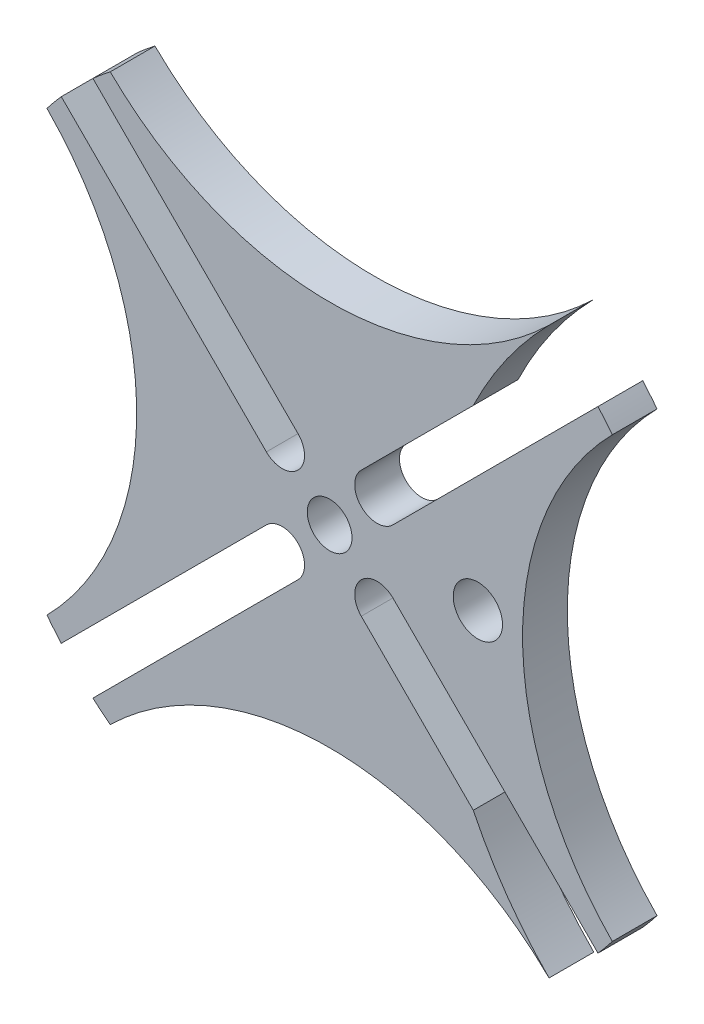
ISO-10303-21;
HEADER;
FILE_DESCRIPTION(('STEP AP214'),'2;1');
FILE_NAME('part.step','',(''),(''),'','','');
FILE_SCHEMA(('AUTOMOTIVE_DESIGN { 1 0 10303 214 1 1 1 1 }'));
ENDSEC;
DATA;
#1=APPLICATION_CONTEXT('core data for automotive mechanical design processes');
#2=APPLICATION_PROTOCOL_DEFINITION('international standard','automotive_design',2000,#1);
#3=PRODUCT_CONTEXT('',#1,'mechanical');
#4=PRODUCT('Part','Part','',(#3));
#5=PRODUCT_RELATED_PRODUCT_CATEGORY('part','',(#4));
#6=PRODUCT_DEFINITION_FORMATION('','',#4);
#7=PRODUCT_DEFINITION_CONTEXT('part definition',#1,'design');
#8=PRODUCT_DEFINITION('design','',#6,#7);
#9=PRODUCT_DEFINITION_SHAPE('','',#8);
#10=(LENGTH_UNIT() NAMED_UNIT(*) SI_UNIT(.MILLI.,.METRE.));
#11=(NAMED_UNIT(*) PLANE_ANGLE_UNIT() SI_UNIT($,.RADIAN.));
#12=(NAMED_UNIT(*) SI_UNIT($,.STERADIAN.) SOLID_ANGLE_UNIT());
#13=UNCERTAINTY_MEASURE_WITH_UNIT(LENGTH_MEASURE(1.E-05),#10,'distance_accuracy_value','');
#14=(GEOMETRIC_REPRESENTATION_CONTEXT(3) GLOBAL_UNCERTAINTY_ASSIGNED_CONTEXT((#13)) GLOBAL_UNIT_ASSIGNED_CONTEXT((#10,
#11,#12)) REPRESENTATION_CONTEXT('',''));
#15=CARTESIAN_POINT('',(0.,0.,0.));
#16=DIRECTION('',(0.,0.,1.));
#17=DIRECTION('',(1.,0.,0.));
#18=AXIS2_PLACEMENT_3D('',#15,#16,#17);
#19=CARTESIAN_POINT('',(4.49719912834645,0.,0.3975));
#20=DIRECTION('',(0.,0.,-1.));
#21=DIRECTION('',(-1.,0.,0.));
#22=AXIS2_PLACEMENT_3D('',#19,#20,#21);
#23=CYLINDRICAL_SURFACE('',#22,3.57750000000001);
#24=CARTESIAN_POINT('',(4.49719912834645,0.,0.));
#25=DIRECTION('',(0.,0.,1.));
#26=DIRECTION('',(1.,0.,0.));
#27=AXIS2_PLACEMENT_3D('',#24,#25,#26);
#28=CIRCLE('',#27,3.57750000000001);
#29=CARTESIAN_POINT('',(1.94995743455646,2.51198447515465,0.));
#30=VERTEX_POINT('',#29);
#31=CARTESIAN_POINT('',(1.27663119004415,1.55770613556581,0.));
#32=VERTEX_POINT('',#31);
#33=EDGE_CURVE('E251',#30,#32,#28,.T.);
#34=ORIENTED_EDGE('',*,*,#33,.F.);
#35=DIRECTION('',(0.,0.,-1.));
#36=VECTOR('',#35,1.);
#37=CARTESIAN_POINT('',(1.94995743455646,2.51198447515465,0.3975));
#38=LINE('',#37,#36);
#39=CARTESIAN_POINT('',(1.94995743455646,2.51198447515465,0.3975));
#40=VERTEX_POINT('',#39);
#41=EDGE_CURVE('E11',#40,#30,#38,.T.);
#42=ORIENTED_EDGE('',*,*,#41,.F.);
#43=CARTESIAN_POINT('',(4.49719912834645,0.,0.3975));
#44=DIRECTION('',(0.,0.,1.));
#45=DIRECTION('',(1.,0.,0.));
#46=AXIS2_PLACEMENT_3D('',#43,#44,#45);
#47=CIRCLE('',#46,3.57750000000001);
#48=CARTESIAN_POINT('',(1.27663119004415,1.55770613556581,0.3975));
#49=VERTEX_POINT('',#48);
#50=EDGE_CURVE('E396',#40,#49,#47,.T.);
#51=ORIENTED_EDGE('',*,*,#50,.T.);
#52=DIRECTION('',(0.,0.,-1.));
#53=VECTOR('',#52,1.);
#54=CARTESIAN_POINT('',(1.27663119004415,1.55770613556581,0.3975));
#55=LINE('',#54,#53);
#56=EDGE_CURVE('E146',#49,#32,#55,.T.);
#57=ORIENTED_EDGE('',*,*,#56,.T.);
#58=EDGE_LOOP('',(#34,#42,#51,#57));
#59=FACE_BOUND('',#58,.T.);
#60=ADVANCED_FACE('F41',(#59),#23,.F.);
#61=CARTESIAN_POINT('',(0.,0.,0.3975));
#62=DIRECTION('',(0.,0.,-1.));
#63=DIRECTION('',(-1.,0.,0.));
#64=AXIS2_PLACEMENT_3D('',#61,#62,#63);
#65=CYLINDRICAL_SURFACE('',#64,3.18);
#66=CARTESIAN_POINT('',(0.,0.,0.));
#67=DIRECTION('',(0.,0.,1.));
#68=DIRECTION('',(1.,0.,0.));
#69=AXIS2_PLACEMENT_3D('',#66,#67,#68);
#70=CIRCLE('',#69,3.18);
#71=CARTESIAN_POINT('',(1.9497991652137,2.51210732559975,0.));
#72=VERTEX_POINT('',#71);
#73=EDGE_CURVE('E254',#30,#72,#70,.T.);
#74=ORIENTED_EDGE('',*,*,#73,.T.);
#75=DIRECTION('',(0.,0.,-1.));
#76=VECTOR('',#75,1.);
#77=CARTESIAN_POINT('',(1.9497991652137,2.51210732559975,0.3975));
#78=LINE('',#77,#76);
#79=CARTESIAN_POINT('',(1.9497991652137,2.51210732559975,0.3975));
#80=VERTEX_POINT('',#79);
#81=EDGE_CURVE('E50',#80,#72,#78,.T.);
#82=ORIENTED_EDGE('',*,*,#81,.F.);
#83=CARTESIAN_POINT('',(0.,0.,0.3975));
#84=DIRECTION('',(0.,0.,1.));
#85=DIRECTION('',(1.,0.,0.));
#86=AXIS2_PLACEMENT_3D('',#83,#84,#85);
#87=CIRCLE('',#86,3.18);
#88=EDGE_CURVE('E394',#40,#80,#87,.T.);
#89=ORIENTED_EDGE('',*,*,#88,.F.);
#90=ORIENTED_EDGE('',*,*,#41,.T.);
#91=EDGE_LOOP('',(#74,#82,#89,#90));
#92=FACE_BOUND('',#91,.T.);
#93=ADVANCED_FACE('F379',(#92),#65,.T.);
#94=CARTESIAN_POINT('',(0.,4.49719912834645,0.3975));
#95=DIRECTION('',(0.,0.,-1.));
#96=DIRECTION('',(-1.,0.,0.));
#97=AXIS2_PLACEMENT_3D('',#94,#95,#96);
#98=CYLINDRICAL_SURFACE('',#97,2.7825);
#99=CARTESIAN_POINT('',(0.,4.49719912834645,0.));
#100=DIRECTION('',(0.,0.,1.));
#101=DIRECTION('',(1.,0.,0.));
#102=AXIS2_PLACEMENT_3D('',#99,#100,#101);
#103=CIRCLE('',#102,2.7825);
#104=CARTESIAN_POINT('',(-1.94979916521365,2.51210732559979,0.));
#105=VERTEX_POINT('',#104);
#106=EDGE_CURVE('E258',#105,#72,#103,.T.);
#107=ORIENTED_EDGE('',*,*,#106,.F.);
#108=DIRECTION('',(0.,0.,-1.));
#109=VECTOR('',#108,1.);
#110=CARTESIAN_POINT('',(-1.94979916521365,2.51210732559979,0.3975));
#111=LINE('',#110,#109);
#112=CARTESIAN_POINT('',(-1.94979916521365,2.51210732559979,0.3975));
#113=VERTEX_POINT('',#112);
#114=EDGE_CURVE('E369',#113,#105,#111,.T.);
#115=ORIENTED_EDGE('',*,*,#114,.F.);
#116=CARTESIAN_POINT('',(0.,4.49719912834645,0.3975));
#117=DIRECTION('',(0.,0.,1.));
#118=DIRECTION('',(1.,0.,0.));
#119=AXIS2_PLACEMENT_3D('',#116,#117,#118);
#120=CIRCLE('',#119,2.7825);
#121=EDGE_CURVE('E376',#113,#80,#120,.T.);
#122=ORIENTED_EDGE('',*,*,#121,.T.);
#123=ORIENTED_EDGE('',*,*,#81,.T.);
#124=EDGE_LOOP('',(#107,#115,#122,#123));
#125=FACE_BOUND('',#124,.T.);
#126=ADVANCED_FACE('F374',(#125),#98,.F.);
#127=CARTESIAN_POINT('',(0.,0.,0.3975));
#128=DIRECTION('',(0.,0.,-1.));
#129=DIRECTION('',(-1.,0.,0.));
#130=AXIS2_PLACEMENT_3D('',#127,#128,#129);
#131=CYLINDRICAL_SURFACE('',#130,3.18);
#132=CARTESIAN_POINT('',(0.,0.,0.));
#133=DIRECTION('',(0.,0.,1.));
#134=DIRECTION('',(1.,0.,0.));
#135=AXIS2_PLACEMENT_3D('',#132,#133,#134);
#136=CIRCLE('',#135,3.18);
#137=CARTESIAN_POINT('',(-2.1036659981281,2.38474094364979,0.));
#138=VERTEX_POINT('',#137);
#139=EDGE_CURVE('E261',#105,#138,#136,.T.);
#140=ORIENTED_EDGE('',*,*,#139,.T.);
#141=DIRECTION('',(0.,0.,-1.));
#142=VECTOR('',#141,1.);
#143=CARTESIAN_POINT('',(-2.1036659981281,2.38474094364979,0.3975));
#144=LINE('',#143,#142);
#145=CARTESIAN_POINT('',(-2.1036659981281,2.38474094364979,0.3975));
#146=VERTEX_POINT('',#145);
#147=EDGE_CURVE('E367',#146,#138,#144,.T.);
#148=ORIENTED_EDGE('',*,*,#147,.F.);
#149=CARTESIAN_POINT('',(0.,0.,0.3975));
#150=DIRECTION('',(0.,0.,1.));
#151=DIRECTION('',(1.,0.,0.));
#152=AXIS2_PLACEMENT_3D('',#149,#150,#151);
#153=CIRCLE('',#152,3.18);
#154=EDGE_CURVE('E390',#113,#146,#153,.T.);
#155=ORIENTED_EDGE('',*,*,#154,.F.);
#156=ORIENTED_EDGE('',*,*,#114,.T.);
#157=EDGE_LOOP('',(#140,#148,#155,#156));
#158=FACE_BOUND('',#157,.T.);
#159=ADVANCED_FACE('F387',(#158),#131,.T.);
#160=CARTESIAN_POINT('',(0.140537472760827,0.140537472760825,0.3975));
#161=DIRECTION('',(-0.707106781186554,-0.707106781186541,0.));
#162=DIRECTION('',(0.707106781186541,-0.707106781186554,0.));
#163=AXIS2_PLACEMENT_3D('',#160,#161,#162);
#164=PLANE('',#163);
#165=DIRECTION('',(-0.707106781186541,0.707106781186554,0.));
#166=VECTOR('',#165,1.);
#167=CARTESIAN_POINT('',(0.140537472760827,0.140537472760825,0.));
#168=LINE('',#167,#166);
#169=CARTESIAN_POINT('',(-0.281074945521648,0.562149891043308,0.));
#170=VERTEX_POINT('',#169);
#171=EDGE_CURVE('E264',#170,#138,#168,.T.);
#172=ORIENTED_EDGE('',*,*,#171,.F.);
#173=DIRECTION('',(0.,0.,-1.));
#174=VECTOR('',#173,1.);
#175=CARTESIAN_POINT('',(-0.281074945521648,0.562149891043308,0.3975));
#176=LINE('',#175,#174);
#177=CARTESIAN_POINT('',(-0.281074945521648,0.562149891043308,0.3975));
#178=VERTEX_POINT('',#177);
#179=EDGE_CURVE('E365',#178,#170,#176,.T.);
#180=ORIENTED_EDGE('',*,*,#179,.F.);
#181=DIRECTION('',(-0.707106781186541,0.707106781186554,0.));
#182=VECTOR('',#181,1.);
#183=CARTESIAN_POINT('',(0.140537472760827,0.140537472760825,0.3975));
#184=LINE('',#183,#182);
#185=EDGE_CURVE('E392',#178,#146,#184,.T.);
#186=ORIENTED_EDGE('',*,*,#185,.T.);
#187=ORIENTED_EDGE('',*,*,#147,.T.);
#188=EDGE_LOOP('',(#172,#180,#186,#187));
#189=FACE_BOUND('',#188,.T.);
#190=ADVANCED_FACE('F631',(#189),#164,.T.);
#191=CARTESIAN_POINT('',(-0.421612418282475,0.421612418282483,0.3975));
#192=DIRECTION('',(0.,0.,-1.));
#193=DIRECTION('',(-1.,0.,0.));
#194=AXIS2_PLACEMENT_3D('',#191,#192,#193);
#195=CYLINDRICAL_SURFACE('',#194,0.19875);
#196=CARTESIAN_POINT('',(-0.421612418282475,0.421612418282483,0.));
#197=DIRECTION('',(0.,0.,1.));
#198=DIRECTION('',(1.,0.,0.));
#199=AXIS2_PLACEMENT_3D('',#196,#197,#198);
#200=CIRCLE('',#199,0.19875);
#201=CARTESIAN_POINT('',(-0.562149891043303,0.281074945521658,0.));
#202=VERTEX_POINT('',#201);
#203=EDGE_CURVE('E267',#202,#170,#200,.T.);
#204=ORIENTED_EDGE('',*,*,#203,.F.);
#205=DIRECTION('',(0.,0.,-1.));
#206=VECTOR('',#205,1.);
#207=CARTESIAN_POINT('',(-0.562149891043303,0.281074945521658,0.3975));
#208=LINE('',#207,#206);
#209=CARTESIAN_POINT('',(-0.562149891043303,0.281074945521658,0.3975));
#210=VERTEX_POINT('',#209);
#211=EDGE_CURVE('E363',#210,#202,#208,.T.);
#212=ORIENTED_EDGE('',*,*,#211,.F.);
#213=CARTESIAN_POINT('',(-0.421612418282475,0.421612418282483,0.3975));
#214=DIRECTION('',(0.,0.,1.));
#215=DIRECTION('',(1.,0.,0.));
#216=AXIS2_PLACEMENT_3D('',#213,#214,#215);
#217=CIRCLE('',#216,0.19875);
#218=EDGE_CURVE('E401',#210,#178,#217,.T.);
#219=ORIENTED_EDGE('',*,*,#218,.T.);
#220=ORIENTED_EDGE('',*,*,#179,.T.);
#221=EDGE_LOOP('',(#204,#212,#219,#220));
#222=FACE_BOUND('',#221,.T.);
#223=ADVANCED_FACE('F620',(#222),#195,.F.);
#224=CARTESIAN_POINT('',(-0.14053747276082,-0.140537472760821,0.3975));
#225=DIRECTION('',(-0.707106781186544,-0.707106781186551,0.));
#226=DIRECTION('',(0.707106781186551,-0.707106781186544,0.));
#227=AXIS2_PLACEMENT_3D('',#224,#225,#226);
#228=PLANE('',#227);
#229=DIRECTION('',(-0.707106781186551,0.707106781186544,0.));
#230=VECTOR('',#229,1.);
#231=CARTESIAN_POINT('',(-0.14053747276082,-0.140537472760821,0.));
#232=LINE('',#231,#230);
#233=CARTESIAN_POINT('',(-2.38474094364978,2.10366599812812,0.));
#234=VERTEX_POINT('',#233);
#235=EDGE_CURVE('E270',#202,#234,#232,.T.);
#236=ORIENTED_EDGE('',*,*,#235,.T.);
#237=DIRECTION('',(0.,0.,-1.));
#238=VECTOR('',#237,1.);
#239=CARTESIAN_POINT('',(-2.38474094364978,2.10366599812812,0.3975));
#240=LINE('',#239,#238);
#241=CARTESIAN_POINT('',(-2.38474094364978,2.10366599812812,0.3975));
#242=VERTEX_POINT('',#241);
#243=EDGE_CURVE('E360',#242,#234,#240,.T.);
#244=ORIENTED_EDGE('',*,*,#243,.F.);
#245=DIRECTION('',(-0.707106781186551,0.707106781186544,0.));
#246=VECTOR('',#245,1.);
#247=CARTESIAN_POINT('',(-0.14053747276082,-0.140537472760821,0.3975));
#248=LINE('',#247,#246);
#249=EDGE_CURVE('E404',#210,#242,#248,.T.);
#250=ORIENTED_EDGE('',*,*,#249,.F.);
#251=ORIENTED_EDGE('',*,*,#211,.T.);
#252=EDGE_LOOP('',(#236,#244,#250,#251));
#253=FACE_BOUND('',#252,.T.);
#254=ADVANCED_FACE('F609',(#253),#228,.F.);
#255=CARTESIAN_POINT('',(0.,0.,0.3975));
#256=DIRECTION('',(0.,0.,-1.));
#257=DIRECTION('',(-1.,0.,0.));
#258=AXIS2_PLACEMENT_3D('',#255,#256,#257);
#259=CYLINDRICAL_SURFACE('',#258,3.18);
#260=CARTESIAN_POINT('',(0.,0.,0.));
#261=DIRECTION('',(0.,0.,1.));
#262=DIRECTION('',(1.,0.,0.));
#263=AXIS2_PLACEMENT_3D('',#260,#261,#262);
#264=CIRCLE('',#263,3.18);
#265=CARTESIAN_POINT('',(-2.51210732559975,1.9497991652137,0.));
#266=VERTEX_POINT('',#265);
#267=EDGE_CURVE('E273',#234,#266,#264,.T.);
#268=ORIENTED_EDGE('',*,*,#267,.T.);
#269=DIRECTION('',(0.,0.,-1.));
#270=VECTOR('',#269,1.);
#271=CARTESIAN_POINT('',(-2.51210732559975,1.9497991652137,0.3975));
#272=LINE('',#271,#270);
#273=CARTESIAN_POINT('',(-2.51210732559975,1.9497991652137,0.3975));
#274=VERTEX_POINT('',#273);
#275=EDGE_CURVE('E358',#274,#266,#272,.T.);
#276=ORIENTED_EDGE('',*,*,#275,.F.);
#277=CARTESIAN_POINT('',(0.,0.,0.3975));
#278=DIRECTION('',(0.,0.,1.));
#279=DIRECTION('',(1.,0.,0.));
#280=AXIS2_PLACEMENT_3D('',#277,#278,#279);
#281=CIRCLE('',#280,3.18);
#282=EDGE_CURVE('E407',#242,#274,#281,.T.);
#283=ORIENTED_EDGE('',*,*,#282,.F.);
#284=ORIENTED_EDGE('',*,*,#243,.T.);
#285=EDGE_LOOP('',(#268,#276,#283,#284));
#286=FACE_BOUND('',#285,.T.);
#287=ADVANCED_FACE('F598',(#286),#259,.T.);
#288=CARTESIAN_POINT('',(-4.49719912834645,0.,0.3975));
#289=DIRECTION('',(0.,0.,-1.));
#290=DIRECTION('',(-1.,0.,0.));
#291=AXIS2_PLACEMENT_3D('',#288,#289,#290);
#292=CYLINDRICAL_SURFACE('',#291,2.78250000000001);
#293=CARTESIAN_POINT('',(-4.49719912834645,0.,0.));
#294=DIRECTION('',(0.,0.,1.));
#295=DIRECTION('',(1.,0.,0.));
#296=AXIS2_PLACEMENT_3D('',#293,#294,#295);
#297=CIRCLE('',#296,2.78250000000001);
#298=CARTESIAN_POINT('',(-2.51210732559978,-1.94979916521367,0.));
#299=VERTEX_POINT('',#298);
#300=EDGE_CURVE('E276',#299,#266,#297,.T.);
#301=ORIENTED_EDGE('',*,*,#300,.F.);
#302=DIRECTION('',(0.,0.,-1.));
#303=VECTOR('',#302,1.);
#304=CARTESIAN_POINT('',(-2.51210732559978,-1.94979916521367,0.3975));
#305=LINE('',#304,#303);
#306=CARTESIAN_POINT('',(-2.51210732559978,-1.94979916521367,0.3975));
#307=VERTEX_POINT('',#306);
#308=EDGE_CURVE('E356',#307,#299,#305,.T.);
#309=ORIENTED_EDGE('',*,*,#308,.F.);
#310=CARTESIAN_POINT('',(-4.49719912834645,0.,0.3975));
#311=DIRECTION('',(0.,0.,1.));
#312=DIRECTION('',(1.,0.,0.));
#313=AXIS2_PLACEMENT_3D('',#310,#311,#312);
#314=CIRCLE('',#313,2.78250000000001);
#315=EDGE_CURVE('E409',#307,#274,#314,.T.);
#316=ORIENTED_EDGE('',*,*,#315,.T.);
#317=ORIENTED_EDGE('',*,*,#275,.T.);
#318=EDGE_LOOP('',(#301,#309,#316,#317));
#319=FACE_BOUND('',#318,.T.);
#320=ADVANCED_FACE('F587',(#319),#292,.F.);
#321=CARTESIAN_POINT('',(0.,0.,0.3975));
#322=DIRECTION('',(0.,0.,-1.));
#323=DIRECTION('',(-1.,0.,0.));
#324=AXIS2_PLACEMENT_3D('',#321,#322,#323);
#325=CYLINDRICAL_SURFACE('',#324,3.18);
#326=CARTESIAN_POINT('',(0.,0.,0.));
#327=DIRECTION('',(0.,0.,1.));
#328=DIRECTION('',(1.,0.,0.));
#329=AXIS2_PLACEMENT_3D('',#326,#327,#328);
#330=CIRCLE('',#329,3.18);
#331=CARTESIAN_POINT('',(-2.38474094364978,-2.10366599812811,0.));
#332=VERTEX_POINT('',#331);
#333=EDGE_CURVE('E279',#299,#332,#330,.T.);
#334=ORIENTED_EDGE('',*,*,#333,.T.);
#335=DIRECTION('',(0.,0.,-1.));
#336=VECTOR('',#335,1.);
#337=CARTESIAN_POINT('',(-2.38474094364978,-2.10366599812811,0.3975));
#338=LINE('',#337,#336);
#339=CARTESIAN_POINT('',(-2.38474094364978,-2.10366599812811,0.3975));
#340=VERTEX_POINT('',#339);
#341=EDGE_CURVE('E354',#340,#332,#338,.T.);
#342=ORIENTED_EDGE('',*,*,#341,.F.);
#343=CARTESIAN_POINT('',(0.,0.,0.3975));
#344=DIRECTION('',(0.,0.,1.));
#345=DIRECTION('',(1.,0.,0.));
#346=AXIS2_PLACEMENT_3D('',#343,#344,#345);
#347=CIRCLE('',#346,3.18);
#348=EDGE_CURVE('E412',#307,#340,#347,.T.);
#349=ORIENTED_EDGE('',*,*,#348,.F.);
#350=ORIENTED_EDGE('',*,*,#308,.T.);
#351=EDGE_LOOP('',(#334,#342,#349,#350));
#352=FACE_BOUND('',#351,.T.);
#353=ADVANCED_FACE('F576',(#352),#325,.T.);
#354=CARTESIAN_POINT('',(-0.140537472760825,0.140537472760827,0.3975));
#355=DIRECTION('',(0.707106781186544,-0.707106781186551,0.));
#356=DIRECTION('',(0.707106781186551,0.707106781186544,0.));
#357=AXIS2_PLACEMENT_3D('',#354,#355,#356);
#358=PLANE('',#357);
#359=DIRECTION('',(-0.707106781186551,-0.707106781186544,0.));
#360=VECTOR('',#359,1.);
#361=CARTESIAN_POINT('',(-0.140537472760825,0.140537472760827,0.));
#362=LINE('',#361,#360);
#363=CARTESIAN_POINT('',(-0.562149891043307,-0.28107494552165,0.));
#364=VERTEX_POINT('',#363);
#365=EDGE_CURVE('E282',#364,#332,#362,.T.);
#366=ORIENTED_EDGE('',*,*,#365,.F.);
#367=DIRECTION('',(0.,0.,-1.));
#368=VECTOR('',#367,1.);
#369=CARTESIAN_POINT('',(-0.562149891043307,-0.28107494552165,0.3975));
#370=LINE('',#369,#368);
#371=CARTESIAN_POINT('',(-0.562149891043307,-0.28107494552165,0.3975));
#372=VERTEX_POINT('',#371);
#373=EDGE_CURVE('E352',#372,#364,#370,.T.);
#374=ORIENTED_EDGE('',*,*,#373,.F.);
#375=DIRECTION('',(-0.707106781186551,-0.707106781186544,0.));
#376=VECTOR('',#375,1.);
#377=CARTESIAN_POINT('',(-0.140537472760825,0.140537472760827,0.3975));
#378=LINE('',#377,#376);
#379=EDGE_CURVE('E414',#372,#340,#378,.T.);
#380=ORIENTED_EDGE('',*,*,#379,.T.);
#381=ORIENTED_EDGE('',*,*,#341,.T.);
#382=EDGE_LOOP('',(#366,#374,#380,#381));
#383=FACE_BOUND('',#382,.T.);
#384=ADVANCED_FACE('F565',(#383),#358,.T.);
#385=CARTESIAN_POINT('',(-0.421612418282481,-0.421612418282477,0.3975));
#386=DIRECTION('',(0.,0.,-1.));
#387=DIRECTION('',(-1.,0.,0.));
#388=AXIS2_PLACEMENT_3D('',#385,#386,#387);
#389=CYLINDRICAL_SURFACE('',#388,0.19875);
#390=CARTESIAN_POINT('',(-0.421612418282481,-0.421612418282477,0.));
#391=DIRECTION('',(0.,0.,1.));
#392=DIRECTION('',(1.,0.,0.));
#393=AXIS2_PLACEMENT_3D('',#390,#391,#392);
#394=CIRCLE('',#393,0.19875);
#395=CARTESIAN_POINT('',(-0.281074945521656,-0.562149891043304,0.));
#396=VERTEX_POINT('',#395);
#397=EDGE_CURVE('E285',#396,#364,#394,.T.);
#398=ORIENTED_EDGE('',*,*,#397,.F.);
#399=DIRECTION('',(0.,0.,-1.));
#400=VECTOR('',#399,1.);
#401=CARTESIAN_POINT('',(-0.281074945521656,-0.562149891043304,0.3975));
#402=LINE('',#401,#400);
#403=CARTESIAN_POINT('',(-0.281074945521656,-0.562149891043304,0.3975));
#404=VERTEX_POINT('',#403);
#405=EDGE_CURVE('E350',#404,#396,#402,.T.);
#406=ORIENTED_EDGE('',*,*,#405,.F.);
#407=CARTESIAN_POINT('',(-0.421612418282481,-0.421612418282477,0.3975));
#408=DIRECTION('',(0.,0.,1.));
#409=DIRECTION('',(1.,0.,0.));
#410=AXIS2_PLACEMENT_3D('',#407,#408,#409);
#411=CIRCLE('',#410,0.19875);
#412=EDGE_CURVE('E417',#404,#372,#411,.T.);
#413=ORIENTED_EDGE('',*,*,#412,.T.);
#414=ORIENTED_EDGE('',*,*,#373,.T.);
#415=EDGE_LOOP('',(#398,#406,#413,#414));
#416=FACE_BOUND('',#415,.T.);
#417=ADVANCED_FACE('F554',(#416),#389,.F.);
#418=CARTESIAN_POINT('',(0.140537472760826,-0.140537472760827,0.3975));
#419=DIRECTION('',(0.707106781186544,-0.707106781186551,0.));
#420=DIRECTION('',(0.707106781186551,0.707106781186544,0.));
#421=AXIS2_PLACEMENT_3D('',#418,#419,#420);
#422=PLANE('',#421);
#423=DIRECTION('',(-0.707106781186551,-0.707106781186544,0.));
#424=VECTOR('',#423,1.);
#425=CARTESIAN_POINT('',(0.140537472760826,-0.140537472760827,0.));
#426=LINE('',#425,#424);
#427=CARTESIAN_POINT('',(-2.10366599812813,-2.38474094364976,0.));
#428=VERTEX_POINT('',#427);
#429=EDGE_CURVE('E288',#396,#428,#426,.T.);
#430=ORIENTED_EDGE('',*,*,#429,.T.);
#431=DIRECTION('',(0.,0.,-1.));
#432=VECTOR('',#431,1.);
#433=CARTESIAN_POINT('',(-2.10366599812813,-2.38474094364976,0.3975));
#434=LINE('',#433,#432);
#435=CARTESIAN_POINT('',(-2.10366599812813,-2.38474094364976,0.3975));
#436=VERTEX_POINT('',#435);
#437=EDGE_CURVE('E347',#436,#428,#434,.T.);
#438=ORIENTED_EDGE('',*,*,#437,.F.);
#439=DIRECTION('',(-0.707106781186551,-0.707106781186544,0.));
#440=VECTOR('',#439,1.);
#441=CARTESIAN_POINT('',(0.140537472760826,-0.140537472760827,0.3975));
#442=LINE('',#441,#440);
#443=EDGE_CURVE('E420',#404,#436,#442,.T.);
#444=ORIENTED_EDGE('',*,*,#443,.F.);
#445=ORIENTED_EDGE('',*,*,#405,.T.);
#446=EDGE_LOOP('',(#430,#438,#444,#445));
#447=FACE_BOUND('',#446,.T.);
#448=ADVANCED_FACE('F543',(#447),#422,.F.);
#449=CARTESIAN_POINT('',(0.,0.,0.3975));
#450=DIRECTION('',(0.,0.,-1.));
#451=DIRECTION('',(-1.,0.,0.));
#452=AXIS2_PLACEMENT_3D('',#449,#450,#451);
#453=CYLINDRICAL_SURFACE('',#452,3.18);
#454=CARTESIAN_POINT('',(0.,0.,0.));
#455=DIRECTION('',(0.,0.,1.));
#456=DIRECTION('',(1.,0.,0.));
#457=AXIS2_PLACEMENT_3D('',#454,#455,#456);
#458=CIRCLE('',#457,3.18);
#459=CARTESIAN_POINT('',(-1.94979916521369,-2.51210732559976,0.));
#460=VERTEX_POINT('',#459);
#461=EDGE_CURVE('E291',#428,#460,#458,.T.);
#462=ORIENTED_EDGE('',*,*,#461,.T.);
#463=DIRECTION('',(0.,0.,-1.));
#464=VECTOR('',#463,1.);
#465=CARTESIAN_POINT('',(-1.94979916521369,-2.51210732559976,0.3975));
#466=LINE('',#465,#464);
#467=CARTESIAN_POINT('',(-1.94979916521369,-2.51210732559976,0.3975));
#468=VERTEX_POINT('',#467);
#469=EDGE_CURVE('E345',#468,#460,#466,.T.);
#470=ORIENTED_EDGE('',*,*,#469,.F.);
#471=CARTESIAN_POINT('',(0.,0.,0.3975));
#472=DIRECTION('',(0.,0.,1.));
#473=DIRECTION('',(1.,0.,0.));
#474=AXIS2_PLACEMENT_3D('',#471,#472,#473);
#475=CIRCLE('',#474,3.18);
#476=EDGE_CURVE('E423',#436,#468,#475,.T.);
#477=ORIENTED_EDGE('',*,*,#476,.F.);
#478=ORIENTED_EDGE('',*,*,#437,.T.);
#479=EDGE_LOOP('',(#462,#470,#477,#478));
#480=FACE_BOUND('',#479,.T.);
#481=ADVANCED_FACE('F532',(#480),#453,.T.);
#482=CARTESIAN_POINT('',(0.,-4.49719912834645,0.3975));
#483=DIRECTION('',(0.,0.,-1.));
#484=DIRECTION('',(-1.,0.,0.));
#485=AXIS2_PLACEMENT_3D('',#482,#483,#484);
#486=CYLINDRICAL_SURFACE('',#485,2.78250000000001);
#487=CARTESIAN_POINT('',(0.,-4.49719912834645,0.));
#488=DIRECTION('',(0.,0.,1.));
#489=DIRECTION('',(1.,0.,0.));
#490=AXIS2_PLACEMENT_3D('',#487,#488,#489);
#491=CIRCLE('',#490,2.78250000000001);
#492=CARTESIAN_POINT('',(1.94979916521368,-2.51210732559977,0.));
#493=VERTEX_POINT('',#492);
#494=EDGE_CURVE('E294',#493,#460,#491,.T.);
#495=ORIENTED_EDGE('',*,*,#494,.F.);
#496=DIRECTION('',(0.,0.,-1.));
#497=VECTOR('',#496,1.);
#498=CARTESIAN_POINT('',(1.94979916521368,-2.51210732559977,0.3975));
#499=LINE('',#498,#497);
#500=CARTESIAN_POINT('',(1.94979916521368,-2.51210732559977,0.3975));
#501=VERTEX_POINT('',#500);
#502=EDGE_CURVE('E343',#501,#493,#499,.T.);
#503=ORIENTED_EDGE('',*,*,#502,.F.);
#504=CARTESIAN_POINT('',(0.,-4.49719912834645,0.3975));
#505=DIRECTION('',(0.,0.,1.));
#506=DIRECTION('',(1.,0.,0.));
#507=AXIS2_PLACEMENT_3D('',#504,#505,#506);
#508=CIRCLE('',#507,2.78250000000001);
#509=EDGE_CURVE('E425',#501,#468,#508,.T.);
#510=ORIENTED_EDGE('',*,*,#509,.T.);
#511=ORIENTED_EDGE('',*,*,#469,.T.);
#512=EDGE_LOOP('',(#495,#503,#510,#511));
#513=FACE_BOUND('',#512,.T.);
#514=ADVANCED_FACE('F485',(#513),#486,.F.);
#515=CARTESIAN_POINT('',(0.,0.,0.3975));
#516=DIRECTION('',(0.,0.,-1.));
#517=DIRECTION('',(-1.,0.,0.));
#518=AXIS2_PLACEMENT_3D('',#515,#516,#517);
#519=CYLINDRICAL_SURFACE('',#518,3.18);
#520=CARTESIAN_POINT('',(0.,0.,0.));
#521=DIRECTION('',(0.,0.,1.));
#522=DIRECTION('',(1.,0.,0.));
#523=AXIS2_PLACEMENT_3D('',#520,#521,#522);
#524=CIRCLE('',#523,3.18);
#525=CARTESIAN_POINT('',(1.94995743455646,-2.51198447515465,0.));
#526=VERTEX_POINT('',#525);
#527=EDGE_CURVE('E297',#493,#526,#524,.T.);
#528=ORIENTED_EDGE('',*,*,#527,.T.);
#529=DIRECTION('',(0.,0.,-1.));
#530=VECTOR('',#529,1.);
#531=CARTESIAN_POINT('',(1.94995743455646,-2.51198447515465,0.3975));
#532=LINE('',#531,#530);
#533=CARTESIAN_POINT('',(1.94995743455646,-2.51198447515465,0.3975));
#534=VERTEX_POINT('',#533);
#535=EDGE_CURVE('E341',#534,#526,#532,.T.);
#536=ORIENTED_EDGE('',*,*,#535,.F.);
#537=CARTESIAN_POINT('',(0.,0.,0.3975));
#538=DIRECTION('',(0.,0.,1.));
#539=DIRECTION('',(1.,0.,0.));
#540=AXIS2_PLACEMENT_3D('',#537,#538,#539);
#541=CIRCLE('',#540,3.18);
#542=EDGE_CURVE('E428',#501,#534,#541,.T.);
#543=ORIENTED_EDGE('',*,*,#542,.F.);
#544=ORIENTED_EDGE('',*,*,#502,.T.);
#545=EDGE_LOOP('',(#528,#536,#543,#544));
#546=FACE_BOUND('',#545,.T.);
#547=ADVANCED_FACE('F477',(#546),#519,.T.);
#548=CARTESIAN_POINT('',(1.27663119004415,-1.55770613556581,0.));
#549=VERTEX_POINT('',#548);
#550=EDGE_CURVE('E255',#549,#526,#28,.T.);
#551=ORIENTED_EDGE('',*,*,#550,.F.);
#552=DIRECTION('',(0.,0.,-1.));
#553=VECTOR('',#552,1.);
#554=CARTESIAN_POINT('',(1.27663119004415,-1.55770613556581,0.3975));
#555=LINE('',#554,#553);
#556=CARTESIAN_POINT('',(1.27663119004415,-1.55770613556581,0.3975));
#557=VERTEX_POINT('',#556);
#558=EDGE_CURVE('E339',#557,#549,#555,.T.);
#559=ORIENTED_EDGE('',*,*,#558,.F.);
#560=EDGE_CURVE('E430',#557,#534,#47,.T.);
#561=ORIENTED_EDGE('',*,*,#560,.T.);
#562=ORIENTED_EDGE('',*,*,#535,.T.);
#563=EDGE_LOOP('',(#551,#559,#561,#562));
#564=FACE_BOUND('',#563,.T.);
#565=ADVANCED_FACE('F469',(#564),#23,.F.);
#566=CARTESIAN_POINT('',(-0.140537472760826,-0.140537472760826,0.3975));
#567=DIRECTION('',(0.707106781186549,0.707106781186546,0.));
#568=DIRECTION('',(-0.707106781186546,0.707106781186549,0.));
#569=AXIS2_PLACEMENT_3D('',#566,#567,#568);
#570=PLANE('',#569);
#571=DIRECTION('',(0.707106781186546,-0.707106781186549,0.));
#572=VECTOR('',#571,1.);
#573=CARTESIAN_POINT('',(-0.140537472760826,-0.140537472760826,0.));
#574=LINE('',#573,#572);
#575=CARTESIAN_POINT('',(0.281074945521652,-0.562149891043306,0.));
#576=VERTEX_POINT('',#575);
#577=EDGE_CURVE('E300',#576,#549,#574,.T.);
#578=ORIENTED_EDGE('',*,*,#577,.F.);
#579=DIRECTION('',(0.,0.,-1.));
#580=VECTOR('',#579,1.);
#581=CARTESIAN_POINT('',(0.281074945521652,-0.562149891043306,0.3975));
#582=LINE('',#581,#580);
#583=CARTESIAN_POINT('',(0.281074945521652,-0.562149891043306,0.3975));
#584=VERTEX_POINT('',#583);
#585=EDGE_CURVE('E337',#584,#576,#582,.T.);
#586=ORIENTED_EDGE('',*,*,#585,.F.);
#587=DIRECTION('',(0.707106781186546,-0.707106781186549,0.));
#588=VECTOR('',#587,1.);
#589=CARTESIAN_POINT('',(-0.140537472760826,-0.140537472760826,0.3975));
#590=LINE('',#589,#588);
#591=EDGE_CURVE('E431',#584,#557,#590,.T.);
#592=ORIENTED_EDGE('',*,*,#591,.T.);
#593=ORIENTED_EDGE('',*,*,#558,.T.);
#594=EDGE_LOOP('',(#578,#586,#592,#593));
#595=FACE_BOUND('',#594,.T.);
#596=ADVANCED_FACE('F476',(#595),#570,.T.);
#597=CARTESIAN_POINT('',(0.421612418282478,-0.42161241828248,0.3975));
#598=DIRECTION('',(0.,0.,-1.));
#599=DIRECTION('',(-1.,0.,0.));
#600=AXIS2_PLACEMENT_3D('',#597,#598,#599);
#601=CYLINDRICAL_SURFACE('',#600,0.19875);
#602=CARTESIAN_POINT('',(0.421612418282478,-0.42161241828248,0.));
#603=DIRECTION('',(0.,0.,1.));
#604=DIRECTION('',(1.,0.,0.));
#605=AXIS2_PLACEMENT_3D('',#602,#603,#604);
#606=CIRCLE('',#605,0.19875);
#607=CARTESIAN_POINT('',(0.562149891043305,-0.281074945521654,0.));
#608=VERTEX_POINT('',#607);
#609=EDGE_CURVE('E303',#608,#576,#606,.T.);
#610=ORIENTED_EDGE('',*,*,#609,.F.);
#611=DIRECTION('',(0.,0.,-1.));
#612=VECTOR('',#611,1.);
#613=CARTESIAN_POINT('',(0.562149891043305,-0.281074945521654,0.3975));
#614=LINE('',#613,#612);
#615=CARTESIAN_POINT('',(0.562149891043305,-0.281074945521654,0.3975));
#616=VERTEX_POINT('',#615);
#617=EDGE_CURVE('E335',#616,#608,#614,.T.);
#618=ORIENTED_EDGE('',*,*,#617,.F.);
#619=CARTESIAN_POINT('',(0.421612418282478,-0.42161241828248,0.3975));
#620=DIRECTION('',(0.,0.,1.));
#621=DIRECTION('',(1.,0.,0.));
#622=AXIS2_PLACEMENT_3D('',#619,#620,#621);
#623=CIRCLE('',#622,0.19875);
#624=EDGE_CURVE('E434',#616,#584,#623,.T.);
#625=ORIENTED_EDGE('',*,*,#624,.T.);
#626=ORIENTED_EDGE('',*,*,#585,.T.);
#627=EDGE_LOOP('',(#610,#618,#625,#626));
#628=FACE_BOUND('',#627,.T.);
#629=ADVANCED_FACE('F483',(#628),#601,.F.);
#630=CARTESIAN_POINT('',(0.140537472760826,0.140537472760826,0.3975));
#631=DIRECTION('',(0.707106781186549,0.707106781186546,0.));
#632=DIRECTION('',(-0.707106781186546,0.707106781186549,0.));
#633=AXIS2_PLACEMENT_3D('',#630,#631,#632);
#634=PLANE('',#633);
#635=DIRECTION('',(0.707106781186546,-0.707106781186549,0.));
#636=VECTOR('',#635,1.);
#637=CARTESIAN_POINT('',(0.140537472760826,0.140537472760826,0.));
#638=LINE('',#637,#636);
#639=CARTESIAN_POINT('',(2.38474094364977,-2.10366599812812,0.));
#640=VERTEX_POINT('',#639);
#641=EDGE_CURVE('E306',#608,#640,#638,.T.);
#642=ORIENTED_EDGE('',*,*,#641,.T.);
#643=DIRECTION('',(0.,0.,-1.));
#644=VECTOR('',#643,1.);
#645=CARTESIAN_POINT('',(2.38474094364977,-2.10366599812812,0.3975));
#646=LINE('',#645,#644);
#647=CARTESIAN_POINT('',(2.38474094364977,-2.10366599812812,0.3975));
#648=VERTEX_POINT('',#647);
#649=EDGE_CURVE('E332',#648,#640,#646,.T.);
#650=ORIENTED_EDGE('',*,*,#649,.F.);
#651=DIRECTION('',(0.707106781186546,-0.707106781186549,0.));
#652=VECTOR('',#651,1.);
#653=CARTESIAN_POINT('',(0.140537472760826,0.140537472760826,0.3975));
#654=LINE('',#653,#652);
#655=EDGE_CURVE('E437',#616,#648,#654,.T.);
#656=ORIENTED_EDGE('',*,*,#655,.F.);
#657=ORIENTED_EDGE('',*,*,#617,.T.);
#658=EDGE_LOOP('',(#642,#650,#656,#657));
#659=FACE_BOUND('',#658,.T.);
#660=ADVANCED_FACE('F466',(#659),#634,.F.);
#661=CARTESIAN_POINT('',(0.,0.,0.3975));
#662=DIRECTION('',(0.,0.,-1.));
#663=DIRECTION('',(-1.,0.,0.));
#664=AXIS2_PLACEMENT_3D('',#661,#662,#663);
#665=CYLINDRICAL_SURFACE('',#664,3.18);
#666=CARTESIAN_POINT('',(0.,0.,0.));
#667=DIRECTION('',(0.,0.,1.));
#668=DIRECTION('',(1.,0.,0.));
#669=AXIS2_PLACEMENT_3D('',#666,#667,#668);
#670=CIRCLE('',#669,3.18);
#671=CARTESIAN_POINT('',(2.51210732559977,-1.94979916521369,0.));
#672=VERTEX_POINT('',#671);
#673=EDGE_CURVE('E309',#640,#672,#670,.T.);
#674=ORIENTED_EDGE('',*,*,#673,.T.);
#675=DIRECTION('',(0.,0.,-1.));
#676=VECTOR('',#675,1.);
#677=CARTESIAN_POINT('',(2.51210732559977,-1.94979916521369,0.3975));
#678=LINE('',#677,#676);
#679=CARTESIAN_POINT('',(2.51210732559977,-1.94979916521369,0.3975));
#680=VERTEX_POINT('',#679);
#681=EDGE_CURVE('E330',#680,#672,#678,.T.);
#682=ORIENTED_EDGE('',*,*,#681,.F.);
#683=CARTESIAN_POINT('',(0.,0.,0.3975));
#684=DIRECTION('',(0.,0.,1.));
#685=DIRECTION('',(1.,0.,0.));
#686=AXIS2_PLACEMENT_3D('',#683,#684,#685);
#687=CIRCLE('',#686,3.18);
#688=EDGE_CURVE('E440',#648,#680,#687,.T.);
#689=ORIENTED_EDGE('',*,*,#688,.F.);
#690=ORIENTED_EDGE('',*,*,#649,.T.);
#691=EDGE_LOOP('',(#674,#682,#689,#690));
#692=FACE_BOUND('',#691,.T.);
#693=ADVANCED_FACE('F451',(#692),#665,.T.);
#694=CARTESIAN_POINT('',(4.49719912834645,0.,0.3975));
#695=DIRECTION('',(0.,0.,-1.));
#696=DIRECTION('',(-1.,0.,0.));
#697=AXIS2_PLACEMENT_3D('',#694,#695,#696);
#698=CYLINDRICAL_SURFACE('',#697,2.78250000000001);
#699=CARTESIAN_POINT('',(4.49719912834645,0.,0.));
#700=DIRECTION('',(0.,0.,1.));
#701=DIRECTION('',(1.,0.,0.));
#702=AXIS2_PLACEMENT_3D('',#699,#700,#701);
#703=CIRCLE('',#702,2.78250000000001);
#704=CARTESIAN_POINT('',(2.51210732559977,1.94979916521369,0.));
#705=VERTEX_POINT('',#704);
#706=EDGE_CURVE('E312',#705,#672,#703,.T.);
#707=ORIENTED_EDGE('',*,*,#706,.F.);
#708=DIRECTION('',(0.,0.,-1.));
#709=VECTOR('',#708,1.);
#710=CARTESIAN_POINT('',(2.51210732559977,1.94979916521369,0.3975));
#711=LINE('',#710,#709);
#712=CARTESIAN_POINT('',(2.51210732559977,1.94979916521369,0.3975));
#713=VERTEX_POINT('',#712);
#714=EDGE_CURVE('E328',#713,#705,#711,.T.);
#715=ORIENTED_EDGE('',*,*,#714,.F.);
#716=CARTESIAN_POINT('',(4.49719912834645,0.,0.3975));
#717=DIRECTION('',(0.,0.,1.));
#718=DIRECTION('',(1.,0.,0.));
#719=AXIS2_PLACEMENT_3D('',#716,#717,#718);
#720=CIRCLE('',#719,2.78250000000001);
#721=EDGE_CURVE('E441',#713,#680,#720,.T.);
#722=ORIENTED_EDGE('',*,*,#721,.T.);
#723=ORIENTED_EDGE('',*,*,#681,.T.);
#724=EDGE_LOOP('',(#707,#715,#722,#723));
#725=FACE_BOUND('',#724,.T.);
#726=ADVANCED_FACE('F445',(#725),#698,.F.);
#727=CARTESIAN_POINT('',(2.38474094364977,2.10366599812812,0.));
#728=VERTEX_POINT('',#727);
#729=EDGE_CURVE('E313',#705,#728,#670,.T.);
#730=ORIENTED_EDGE('',*,*,#729,.T.);
#731=DIRECTION('',(0.,0.,-1.));
#732=VECTOR('',#731,1.);
#733=CARTESIAN_POINT('',(2.38474094364977,2.10366599812812,0.3975));
#734=LINE('',#733,#732);
#735=CARTESIAN_POINT('',(2.38474094364977,2.10366599812812,0.3975));
#736=VERTEX_POINT('',#735);
#737=EDGE_CURVE('E230',#736,#728,#734,.T.);
#738=ORIENTED_EDGE('',*,*,#737,.F.);
#739=EDGE_CURVE('E237',#713,#736,#687,.T.);
#740=ORIENTED_EDGE('',*,*,#739,.F.);
#741=ORIENTED_EDGE('',*,*,#714,.T.);
#742=EDGE_LOOP('',(#730,#738,#740,#741));
#743=FACE_BOUND('',#742,.T.);
#744=ADVANCED_FACE('F456',(#743),#665,.T.);
#745=CARTESIAN_POINT('',(0.140537472760827,-0.140537472760826,0.3975));
#746=DIRECTION('',(-0.707106781186549,0.707106781186546,0.));
#747=DIRECTION('',(-0.707106781186546,-0.707106781186549,0.));
#748=AXIS2_PLACEMENT_3D('',#745,#746,#747);
#749=PLANE('',#748);
#750=DIRECTION('',(0.707106781186546,0.707106781186549,0.));
#751=VECTOR('',#750,1.);
#752=CARTESIAN_POINT('',(0.140537472760827,-0.140537472760826,0.));
#753=LINE('',#752,#751);
#754=CARTESIAN_POINT('',(0.562149891043305,0.281074945521654,0.));
#755=VERTEX_POINT('',#754);
#756=EDGE_CURVE('E225',#755,#728,#753,.T.);
#757=ORIENTED_EDGE('',*,*,#756,.F.);
#758=DIRECTION('',(0.,0.,-1.));
#759=VECTOR('',#758,1.);
#760=CARTESIAN_POINT('',(0.562149891043305,0.281074945521654,0.3975));
#761=LINE('',#760,#759);
#762=CARTESIAN_POINT('',(0.562149891043305,0.281074945521654,0.3975));
#763=VERTEX_POINT('',#762);
#764=EDGE_CURVE('E220',#763,#755,#761,.T.);
#765=ORIENTED_EDGE('',*,*,#764,.F.);
#766=DIRECTION('',(0.707106781186546,0.707106781186549,0.));
#767=VECTOR('',#766,1.);
#768=CARTESIAN_POINT('',(0.140537472760827,-0.140537472760826,0.3975));
#769=LINE('',#768,#767);
#770=EDGE_CURVE('E223',#763,#736,#769,.T.);
#771=ORIENTED_EDGE('',*,*,#770,.T.);
#772=ORIENTED_EDGE('',*,*,#737,.T.);
#773=EDGE_LOOP('',(#757,#765,#771,#772));
#774=FACE_BOUND('',#773,.T.);
#775=ADVANCED_FACE('F222',(#774),#749,.T.);
#776=CARTESIAN_POINT('',(0.421612418282478,0.42161241828248,0.3975));
#777=DIRECTION('',(0.,0.,-1.));
#778=DIRECTION('',(-1.,0.,0.));
#779=AXIS2_PLACEMENT_3D('',#776,#777,#778);
#780=CYLINDRICAL_SURFACE('',#779,0.19875);
#781=CARTESIAN_POINT('',(0.421612418282478,0.42161241828248,0.));
#782=DIRECTION('',(0.,0.,1.));
#783=DIRECTION('',(1.,0.,0.));
#784=AXIS2_PLACEMENT_3D('',#781,#782,#783);
#785=CIRCLE('',#784,0.19875);
#786=CARTESIAN_POINT('',(0.281074945521652,0.562149891043306,0.));
#787=VERTEX_POINT('',#786);
#788=EDGE_CURVE('E317',#787,#755,#785,.T.);
#789=ORIENTED_EDGE('',*,*,#788,.F.);
#790=DIRECTION('',(0.,0.,-1.));
#791=VECTOR('',#790,1.);
#792=CARTESIAN_POINT('',(0.281074945521652,0.562149891043306,0.3975));
#793=LINE('',#792,#791);
#794=CARTESIAN_POINT('',(0.281074945521652,0.562149891043306,0.3975));
#795=VERTEX_POINT('',#794);
#796=EDGE_CURVE('E139',#795,#787,#793,.T.);
#797=ORIENTED_EDGE('',*,*,#796,.F.);
#798=CARTESIAN_POINT('',(0.421612418282478,0.42161241828248,0.3975));
#799=DIRECTION('',(0.,0.,1.));
#800=DIRECTION('',(1.,0.,0.));
#801=AXIS2_PLACEMENT_3D('',#798,#799,#800);
#802=CIRCLE('',#801,0.19875);
#803=EDGE_CURVE('E234',#795,#763,#802,.T.);
#804=ORIENTED_EDGE('',*,*,#803,.T.);
#805=ORIENTED_EDGE('',*,*,#764,.T.);
#806=EDGE_LOOP('',(#789,#797,#804,#805));
#807=FACE_BOUND('',#806,.T.);
#808=ADVANCED_FACE('F240',(#807),#780,.F.);
#809=CARTESIAN_POINT('',(-0.140537472760827,0.140537472760826,0.3975));
#810=DIRECTION('',(-0.707106781186549,0.707106781186546,0.));
#811=DIRECTION('',(-0.707106781186546,-0.707106781186549,0.));
#812=AXIS2_PLACEMENT_3D('',#809,#810,#811);
#813=PLANE('',#812);
#814=DIRECTION('',(0.707106781186546,0.707106781186549,0.));
#815=VECTOR('',#814,1.);
#816=CARTESIAN_POINT('',(-0.140537472760827,0.140537472760826,0.));
#817=LINE('',#816,#815);
#818=EDGE_CURVE('E319',#787,#32,#817,.T.);
#819=ORIENTED_EDGE('',*,*,#818,.T.);
#820=ORIENTED_EDGE('',*,*,#56,.F.);
#821=DIRECTION('',(0.707106781186546,0.707106781186549,0.));
#822=VECTOR('',#821,1.);
#823=CARTESIAN_POINT('',(-0.140537472760827,0.140537472760826,0.3975));
#824=LINE('',#823,#822);
#825=EDGE_CURVE('E58',#795,#49,#824,.T.);
#826=ORIENTED_EDGE('',*,*,#825,.F.);
#827=ORIENTED_EDGE('',*,*,#796,.T.);
#828=EDGE_LOOP('',(#819,#820,#826,#827));
#829=FACE_BOUND('',#828,.T.);
#830=ADVANCED_FACE('F732',(#829),#813,.F.);
#831=CARTESIAN_POINT('',(0.,0.,0.3975));
#832=DIRECTION('',(0.,0.,-1.));
#833=DIRECTION('',(-1.,0.,0.));
#834=AXIS2_PLACEMENT_3D('',#831,#832,#833);
#835=CYLINDRICAL_SURFACE('',#834,0.19875);
#836=CARTESIAN_POINT('',(0.,0.,0.3975));
#837=DIRECTION('',(0.,0.,1.));
#838=DIRECTION('',(1.,0.,0.));
#839=AXIS2_PLACEMENT_3D('',#836,#837,#838);
#840=CIRCLE('',#839,0.19875);
#841=CARTESIAN_POINT('',(0.19875,0.,0.3975));
#842=VERTEX_POINT('',#841);
#843=EDGE_CURVE('E324',#842,#842,#840,.T.);
#844=ORIENTED_EDGE('',*,*,#843,.T.);
#845=EDGE_LOOP('',(#844));
#846=FACE_BOUND('',#845,.T.);
#847=CARTESIAN_POINT('',(0.,0.,0.));
#848=DIRECTION('',(0.,0.,1.));
#849=DIRECTION('',(1.,0.,0.));
#850=AXIS2_PLACEMENT_3D('',#847,#848,#849);
#851=CIRCLE('',#850,0.19875);
#852=CARTESIAN_POINT('',(0.19875,0.,0.));
#853=VERTEX_POINT('',#852);
#854=EDGE_CURVE('E248',#853,#853,#851,.T.);
#855=ORIENTED_EDGE('',*,*,#854,.F.);
#856=EDGE_LOOP('',(#855));
#857=FACE_BOUND('',#856,.T.);
#858=ADVANCED_FACE('F43',(#846,#857),#835,.F.);
#859=CARTESIAN_POINT('',(1.31719912834644,0.,0.3975));
#860=DIRECTION('',(0.,0.,-1.));
#861=DIRECTION('',(-1.,0.,0.));
#862=AXIS2_PLACEMENT_3D('',#859,#860,#861);
#863=CYLINDRICAL_SURFACE('',#862,0.21897891753536);
#864=CARTESIAN_POINT('',(1.31719912834644,0.,0.3975));
#865=DIRECTION('',(0.,0.,1.));
#866=DIRECTION('',(1.,0.,0.));
#867=AXIS2_PLACEMENT_3D('',#864,#865,#866);
#868=CIRCLE('',#867,0.21897891753536);
#869=CARTESIAN_POINT('',(1.5361780458818,0.,0.3975));
#870=VERTEX_POINT('',#869);
#871=EDGE_CURVE('E242',#870,#870,#868,.T.);
#872=ORIENTED_EDGE('',*,*,#871,.T.);
#873=EDGE_LOOP('',(#872));
#874=FACE_BOUND('',#873,.T.);
#875=CARTESIAN_POINT('',(1.31719912834644,0.,0.));
#876=DIRECTION('',(0.,0.,1.));
#877=DIRECTION('',(1.,0.,0.));
#878=AXIS2_PLACEMENT_3D('',#875,#876,#877);
#879=CIRCLE('',#878,0.21897891753536);
#880=CARTESIAN_POINT('',(1.5361780458818,0.,0.));
#881=VERTEX_POINT('',#880);
#882=EDGE_CURVE('E321',#881,#881,#879,.T.);
#883=ORIENTED_EDGE('',*,*,#882,.F.);
#884=EDGE_LOOP('',(#883));
#885=FACE_BOUND('',#884,.T.);
#886=ADVANCED_FACE('F749',(#874,#885),#863,.F.);
#887=CARTESIAN_POINT('',(0.,0.,0.3975));
#888=DIRECTION('',(0.,0.,1.));
#889=DIRECTION('',(1.,0.,0.));
#890=AXIS2_PLACEMENT_3D('',#887,#888,#889);
#891=PLANE('',#890);
#892=ORIENTED_EDGE('',*,*,#843,.F.);
#893=EDGE_LOOP('',(#892));
#894=FACE_BOUND('',#893,.T.);
#895=ORIENTED_EDGE('',*,*,#50,.F.);
#896=ORIENTED_EDGE('',*,*,#88,.T.);
#897=ORIENTED_EDGE('',*,*,#121,.F.);
#898=ORIENTED_EDGE('',*,*,#154,.T.);
#899=ORIENTED_EDGE('',*,*,#185,.F.);
#900=ORIENTED_EDGE('',*,*,#218,.F.);
#901=ORIENTED_EDGE('',*,*,#249,.T.);
#902=ORIENTED_EDGE('',*,*,#282,.T.);
#903=ORIENTED_EDGE('',*,*,#315,.F.);
#904=ORIENTED_EDGE('',*,*,#348,.T.);
#905=ORIENTED_EDGE('',*,*,#379,.F.);
#906=ORIENTED_EDGE('',*,*,#412,.F.);
#907=ORIENTED_EDGE('',*,*,#443,.T.);
#908=ORIENTED_EDGE('',*,*,#476,.T.);
#909=ORIENTED_EDGE('',*,*,#509,.F.);
#910=ORIENTED_EDGE('',*,*,#542,.T.);
#911=ORIENTED_EDGE('',*,*,#560,.F.);
#912=ORIENTED_EDGE('',*,*,#591,.F.);
#913=ORIENTED_EDGE('',*,*,#624,.F.);
#914=ORIENTED_EDGE('',*,*,#655,.T.);
#915=ORIENTED_EDGE('',*,*,#688,.T.);
#916=ORIENTED_EDGE('',*,*,#721,.F.);
#917=ORIENTED_EDGE('',*,*,#739,.T.);
#918=ORIENTED_EDGE('',*,*,#770,.F.);
#919=ORIENTED_EDGE('',*,*,#803,.F.);
#920=ORIENTED_EDGE('',*,*,#825,.T.);
#921=EDGE_LOOP('',(#895,#896,#897,#898,#899,#900,#901,#902,#903,#904,#905,#906,#907,#908,#909,
#910,#911,#912,#913,#914,#915,#916,#917,#918,#919,#920));
#922=FACE_BOUND('',#921,.T.);
#923=ORIENTED_EDGE('',*,*,#871,.F.);
#924=EDGE_LOOP('',(#923));
#925=FACE_BOUND('',#924,.T.);
#926=ADVANCED_FACE('F232',(#894,#922,#925),#891,.T.);
#927=CARTESIAN_POINT('',(0.,0.,0.));
#928=DIRECTION('',(0.,0.,1.));
#929=DIRECTION('',(1.,0.,0.));
#930=AXIS2_PLACEMENT_3D('',#927,#928,#929);
#931=PLANE('',#930);
#932=ORIENTED_EDGE('',*,*,#854,.T.);
#933=EDGE_LOOP('',(#932));
#934=FACE_BOUND('',#933,.T.);
#935=ORIENTED_EDGE('',*,*,#33,.T.);
#936=ORIENTED_EDGE('',*,*,#818,.F.);
#937=ORIENTED_EDGE('',*,*,#788,.T.);
#938=ORIENTED_EDGE('',*,*,#756,.T.);
#939=ORIENTED_EDGE('',*,*,#729,.F.);
#940=ORIENTED_EDGE('',*,*,#706,.T.);
#941=ORIENTED_EDGE('',*,*,#673,.F.);
#942=ORIENTED_EDGE('',*,*,#641,.F.);
#943=ORIENTED_EDGE('',*,*,#609,.T.);
#944=ORIENTED_EDGE('',*,*,#577,.T.);
#945=ORIENTED_EDGE('',*,*,#550,.T.);
#946=ORIENTED_EDGE('',*,*,#527,.F.);
#947=ORIENTED_EDGE('',*,*,#494,.T.);
#948=ORIENTED_EDGE('',*,*,#461,.F.);
#949=ORIENTED_EDGE('',*,*,#429,.F.);
#950=ORIENTED_EDGE('',*,*,#397,.T.);
#951=ORIENTED_EDGE('',*,*,#365,.T.);
#952=ORIENTED_EDGE('',*,*,#333,.F.);
#953=ORIENTED_EDGE('',*,*,#300,.T.);
#954=ORIENTED_EDGE('',*,*,#267,.F.);
#955=ORIENTED_EDGE('',*,*,#235,.F.);
#956=ORIENTED_EDGE('',*,*,#203,.T.);
#957=ORIENTED_EDGE('',*,*,#171,.T.);
#958=ORIENTED_EDGE('',*,*,#139,.F.);
#959=ORIENTED_EDGE('',*,*,#106,.T.);
#960=ORIENTED_EDGE('',*,*,#73,.F.);
#961=EDGE_LOOP('',(#935,#936,#937,#938,#939,#940,#941,#942,#943,#944,#945,#946,#947,#948,#949,
#950,#951,#952,#953,#954,#955,#956,#957,#958,#959,#960));
#962=FACE_BOUND('',#961,.T.);
#963=ORIENTED_EDGE('',*,*,#882,.T.);
#964=EDGE_LOOP('',(#963));
#965=FACE_BOUND('',#964,.T.);
#966=ADVANCED_FACE('F382',(#934,#962,#965),#931,.F.);
#967=CLOSED_SHELL('',(#60,#93,#126,#159,#190,#223,#254,#287,#320,#353,#384,#417,#448,#481,#514,
#547,#565,#596,#629,#660,#693,#726,#744,#775,#808,#830,#858,#886,#926,#966));
#968=MANIFOLD_SOLID_BREP('B2',#967);
#969=ADVANCED_BREP_SHAPE_REPRESENTATION('',(#18,#968),#14);
#970=SHAPE_DEFINITION_REPRESENTATION(#9,#969);
ENDSEC;
END-ISO-10303-21;
